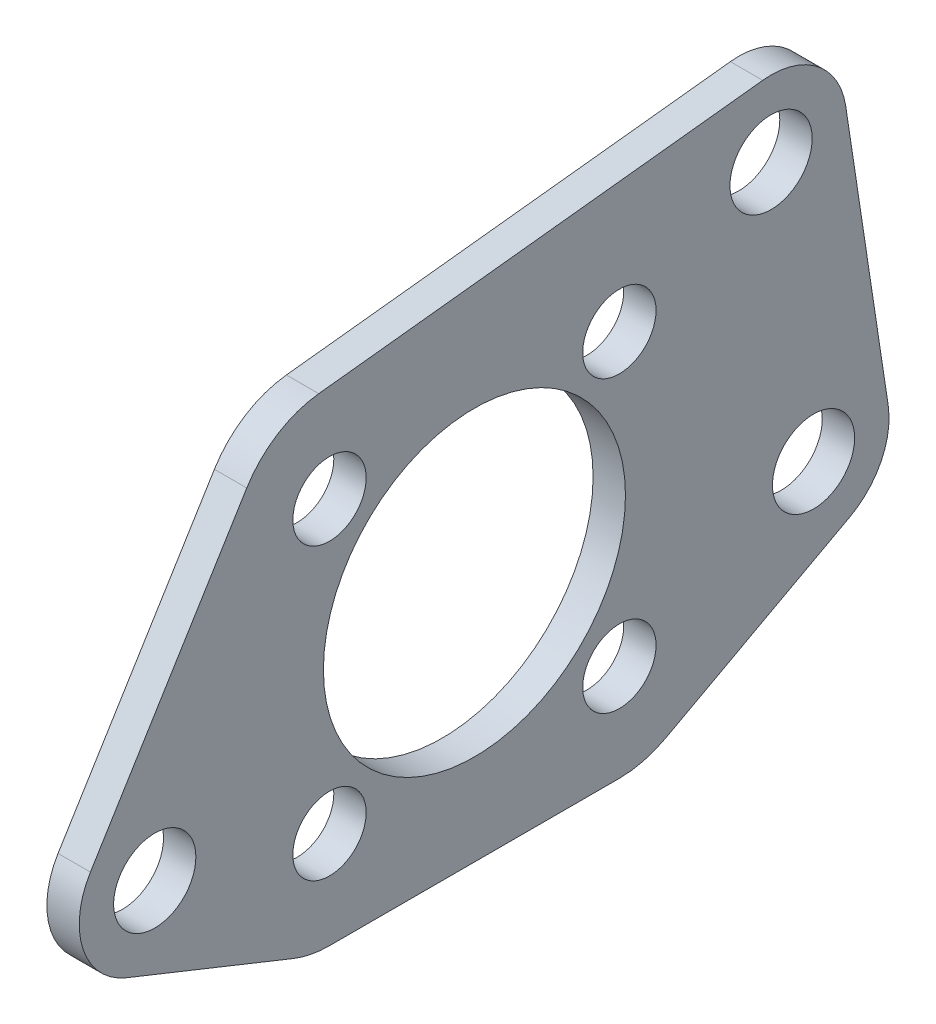
ISO-10303-21;
HEADER;
FILE_DESCRIPTION(('STEP AP214'),'2;1');
FILE_NAME('part.step','',(''),(''),'','','');
FILE_SCHEMA(('AUTOMOTIVE_DESIGN { 1 0 10303 214 1 1 1 1 }'));
ENDSEC;
DATA;
#1=APPLICATION_CONTEXT('core data for automotive mechanical design processes');
#2=APPLICATION_PROTOCOL_DEFINITION('international standard','automotive_design',2000,#1);
#3=PRODUCT_CONTEXT('',#1,'mechanical');
#4=PRODUCT('Part','Part','',(#3));
#5=PRODUCT_RELATED_PRODUCT_CATEGORY('part','',(#4));
#6=PRODUCT_DEFINITION_FORMATION('','',#4);
#7=PRODUCT_DEFINITION_CONTEXT('part definition',#1,'design');
#8=PRODUCT_DEFINITION('design','',#6,#7);
#9=PRODUCT_DEFINITION_SHAPE('','',#8);
#10=(LENGTH_UNIT() NAMED_UNIT(*) SI_UNIT(.MILLI.,.METRE.));
#11=(NAMED_UNIT(*) PLANE_ANGLE_UNIT() SI_UNIT($,.RADIAN.));
#12=(NAMED_UNIT(*) SI_UNIT($,.STERADIAN.) SOLID_ANGLE_UNIT());
#13=UNCERTAINTY_MEASURE_WITH_UNIT(LENGTH_MEASURE(1.E-05),#10,'distance_accuracy_value','');
#14=(GEOMETRIC_REPRESENTATION_CONTEXT(3) GLOBAL_UNCERTAINTY_ASSIGNED_CONTEXT((#13)) GLOBAL_UNIT_ASSIGNED_CONTEXT((#10,
#11,#12)) REPRESENTATION_CONTEXT('',''));
#15=CARTESIAN_POINT('',(0.,0.,0.));
#16=DIRECTION('',(0.,0.,1.));
#17=DIRECTION('',(1.,0.,0.));
#18=AXIS2_PLACEMENT_3D('',#15,#16,#17);
#19=CARTESIAN_POINT('',(105.440106080913,27.7175144212722,115.08697369881));
#20=DIRECTION('',(-1.,0.,0.));
#21=DIRECTION('',(0.,0.,1.));
#22=AXIS2_PLACEMENT_3D('',#19,#20,#21);
#23=CYLINDRICAL_SURFACE('',#22,1.7);
#24=CARTESIAN_POINT('',(59.,27.7175144212722,115.08697369881));
#25=DIRECTION('',(1.,0.,0.));
#26=DIRECTION('',(0.,0.,-1.));
#27=AXIS2_PLACEMENT_3D('',#24,#25,#26);
#28=CIRCLE('',#27,1.7);
#29=CARTESIAN_POINT('',(59.,27.7175144212722,113.38697369881));
#30=VERTEX_POINT('',#29);
#31=EDGE_CURVE('E182',#30,#30,#28,.T.);
#32=ORIENTED_EDGE('',*,*,#31,.F.);
#33=EDGE_LOOP('',(#32));
#34=FACE_BOUND('',#33,.T.);
#35=CARTESIAN_POINT('',(60.5,27.7175144212722,115.08697369881));
#36=DIRECTION('',(1.,0.,0.));
#37=DIRECTION('',(0.,0.,-1.));
#38=AXIS2_PLACEMENT_3D('',#35,#36,#37);
#39=CIRCLE('',#38,1.7);
#40=CARTESIAN_POINT('',(60.5,27.7175144212722,113.38697369881));
#41=VERTEX_POINT('',#40);
#42=EDGE_CURVE('E489',#41,#41,#39,.T.);
#43=ORIENTED_EDGE('',*,*,#42,.T.);
#44=EDGE_LOOP('',(#43));
#45=FACE_BOUND('',#44,.T.);
#46=ADVANCED_FACE('F39',(#34,#45),#23,.F.);
#47=CARTESIAN_POINT('',(105.440106080913,14.2824855787278,115.086973698809));
#48=DIRECTION('',(-1.,0.,0.));
#49=DIRECTION('',(0.,0.,1.));
#50=AXIS2_PLACEMENT_3D('',#47,#48,#49);
#51=CYLINDRICAL_SURFACE('',#50,1.7);
#52=CARTESIAN_POINT('',(59.,14.2824855787278,115.086973698809));
#53=DIRECTION('',(1.,0.,0.));
#54=DIRECTION('',(0.,0.,-1.));
#55=AXIS2_PLACEMENT_3D('',#52,#53,#54);
#56=CIRCLE('',#55,1.7);
#57=CARTESIAN_POINT('',(59.,14.2824855787278,113.386973698809));
#58=VERTEX_POINT('',#57);
#59=EDGE_CURVE('E185',#58,#58,#56,.T.);
#60=ORIENTED_EDGE('',*,*,#59,.F.);
#61=EDGE_LOOP('',(#60));
#62=FACE_BOUND('',#61,.T.);
#63=CARTESIAN_POINT('',(60.5,14.2824855787278,115.086973698809));
#64=DIRECTION('',(1.,0.,0.));
#65=DIRECTION('',(0.,0.,-1.));
#66=AXIS2_PLACEMENT_3D('',#63,#64,#65);
#67=CIRCLE('',#66,1.7);
#68=CARTESIAN_POINT('',(60.5,14.2824855787278,113.386973698809));
#69=VERTEX_POINT('',#68);
#70=EDGE_CURVE('E493',#69,#69,#67,.T.);
#71=ORIENTED_EDGE('',*,*,#70,.T.);
#72=EDGE_LOOP('',(#71));
#73=FACE_BOUND('',#72,.T.);
#74=ADVANCED_FACE('F302',(#62,#73),#51,.F.);
#75=CARTESIAN_POINT('',(105.440106080913,14.2824855787278,101.651944856265));
#76=DIRECTION('',(-1.,0.,0.));
#77=DIRECTION('',(0.,0.,1.));
#78=AXIS2_PLACEMENT_3D('',#75,#76,#77);
#79=CYLINDRICAL_SURFACE('',#78,1.7);
#80=CARTESIAN_POINT('',(59.,14.2824855787278,101.651944856265));
#81=DIRECTION('',(1.,0.,0.));
#82=DIRECTION('',(0.,0.,-1.));
#83=AXIS2_PLACEMENT_3D('',#80,#81,#82);
#84=CIRCLE('',#83,1.7);
#85=CARTESIAN_POINT('',(59.,14.2824855787278,99.9519448562651));
#86=VERTEX_POINT('',#85);
#87=EDGE_CURVE('E188',#86,#86,#84,.T.);
#88=ORIENTED_EDGE('',*,*,#87,.F.);
#89=EDGE_LOOP('',(#88));
#90=FACE_BOUND('',#89,.T.);
#91=CARTESIAN_POINT('',(60.5,14.2824855787278,101.651944856265));
#92=DIRECTION('',(1.,0.,0.));
#93=DIRECTION('',(0.,0.,-1.));
#94=AXIS2_PLACEMENT_3D('',#91,#92,#93);
#95=CIRCLE('',#94,1.7);
#96=CARTESIAN_POINT('',(60.5,14.2824855787278,99.9519448562651));
#97=VERTEX_POINT('',#96);
#98=EDGE_CURVE('E497',#97,#97,#95,.T.);
#99=ORIENTED_EDGE('',*,*,#98,.T.);
#100=EDGE_LOOP('',(#99));
#101=FACE_BOUND('',#100,.T.);
#102=ADVANCED_FACE('F309',(#90,#101),#79,.F.);
#103=CARTESIAN_POINT('',(105.440106080913,16.4458298924749,123.185313442307));
#104=DIRECTION('',(-1.,0.,0.));
#105=DIRECTION('',(0.,0.,1.));
#106=AXIS2_PLACEMENT_3D('',#103,#104,#105);
#107=CYLINDRICAL_SURFACE('',#106,1.90500000000001);
#108=CARTESIAN_POINT('',(59.,16.4458298924749,123.185313442307));
#109=DIRECTION('',(1.,0.,0.));
#110=DIRECTION('',(0.,0.,-1.));
#111=AXIS2_PLACEMENT_3D('',#108,#109,#110);
#112=CIRCLE('',#111,1.90500000000001);
#113=CARTESIAN_POINT('',(59.,16.4458298924749,121.280313442307));
#114=VERTEX_POINT('',#113);
#115=EDGE_CURVE('E191',#114,#114,#112,.T.);
#116=ORIENTED_EDGE('',*,*,#115,.F.);
#117=EDGE_LOOP('',(#116));
#118=FACE_BOUND('',#117,.T.);
#119=CARTESIAN_POINT('',(60.5,16.4458298924749,123.185313442307));
#120=DIRECTION('',(1.,0.,0.));
#121=DIRECTION('',(0.,0.,-1.));
#122=AXIS2_PLACEMENT_3D('',#119,#120,#121);
#123=CIRCLE('',#122,1.90500000000001);
#124=CARTESIAN_POINT('',(60.5,16.4458298924749,121.280313442307));
#125=VERTEX_POINT('',#124);
#126=EDGE_CURVE('E501',#125,#125,#123,.T.);
#127=ORIENTED_EDGE('',*,*,#126,.T.);
#128=EDGE_LOOP('',(#127));
#129=FACE_BOUND('',#128,.T.);
#130=ADVANCED_FACE('F320',(#118,#129),#107,.F.);
#131=CARTESIAN_POINT('',(105.440106080913,18.,92.6532256320356));
#132=DIRECTION('',(-1.,0.,0.));
#133=DIRECTION('',(0.,0.,1.));
#134=AXIS2_PLACEMENT_3D('',#131,#132,#133);
#135=CYLINDRICAL_SURFACE('',#134,1.90500000000001);
#136=CARTESIAN_POINT('',(59.,18.,92.6532256320356));
#137=DIRECTION('',(1.,0.,0.));
#138=DIRECTION('',(0.,0.,-1.));
#139=AXIS2_PLACEMENT_3D('',#136,#137,#138);
#140=CIRCLE('',#139,1.90500000000001);
#141=CARTESIAN_POINT('',(59.,18.,90.7482256320356));
#142=VERTEX_POINT('',#141);
#143=EDGE_CURVE('E194',#142,#142,#140,.T.);
#144=ORIENTED_EDGE('',*,*,#143,.F.);
#145=EDGE_LOOP('',(#144));
#146=FACE_BOUND('',#145,.T.);
#147=CARTESIAN_POINT('',(60.5,18.,92.6532256320356));
#148=DIRECTION('',(1.,0.,0.));
#149=DIRECTION('',(0.,0.,-1.));
#150=AXIS2_PLACEMENT_3D('',#147,#148,#149);
#151=CIRCLE('',#150,1.90500000000001);
#152=CARTESIAN_POINT('',(60.5,18.,90.7482256320356));
#153=VERTEX_POINT('',#152);
#154=EDGE_CURVE('E505',#153,#153,#151,.T.);
#155=ORIENTED_EDGE('',*,*,#154,.T.);
#156=EDGE_LOOP('',(#155));
#157=FACE_BOUND('',#156,.T.);
#158=ADVANCED_FACE('F324',(#146,#157),#135,.F.);
#159=CARTESIAN_POINT('',(105.440106080913,31.,94.6217321926698));
#160=DIRECTION('',(-1.,0.,0.));
#161=DIRECTION('',(0.,0.,1.));
#162=AXIS2_PLACEMENT_3D('',#159,#160,#161);
#163=CYLINDRICAL_SURFACE('',#162,1.90500000000001);
#164=CARTESIAN_POINT('',(59.,31.,94.6217321926698));
#165=DIRECTION('',(1.,0.,0.));
#166=DIRECTION('',(0.,0.,-1.));
#167=AXIS2_PLACEMENT_3D('',#164,#165,#166);
#168=CIRCLE('',#167,1.90500000000001);
#169=CARTESIAN_POINT('',(59.,31.,92.7167321926698));
#170=VERTEX_POINT('',#169);
#171=EDGE_CURVE('E197',#170,#170,#168,.T.);
#172=ORIENTED_EDGE('',*,*,#171,.F.);
#173=EDGE_LOOP('',(#172));
#174=FACE_BOUND('',#173,.T.);
#175=CARTESIAN_POINT('',(60.5,31.,94.6217321926698));
#176=DIRECTION('',(1.,0.,0.));
#177=DIRECTION('',(0.,0.,-1.));
#178=AXIS2_PLACEMENT_3D('',#175,#176,#177);
#179=CIRCLE('',#178,1.90500000000001);
#180=CARTESIAN_POINT('',(60.5,31.,92.7167321926698));
#181=VERTEX_POINT('',#180);
#182=EDGE_CURVE('E153',#181,#181,#179,.T.);
#183=ORIENTED_EDGE('',*,*,#182,.T.);
#184=EDGE_LOOP('',(#183));
#185=FACE_BOUND('',#184,.T.);
#186=ADVANCED_FACE('F328',(#174,#185),#163,.F.);
#187=CARTESIAN_POINT('',(105.440106080913,27.7175144212722,101.651944856265));
#188=DIRECTION('',(-1.,0.,0.));
#189=DIRECTION('',(0.,0.,1.));
#190=AXIS2_PLACEMENT_3D('',#187,#188,#189);
#191=CYLINDRICAL_SURFACE('',#190,1.7);
#192=CARTESIAN_POINT('',(59.,27.7175144212722,101.651944856265));
#193=DIRECTION('',(1.,0.,0.));
#194=DIRECTION('',(0.,0.,-1.));
#195=AXIS2_PLACEMENT_3D('',#192,#193,#194);
#196=CIRCLE('',#195,1.7);
#197=CARTESIAN_POINT('',(59.,27.7175144212722,99.9519448562651));
#198=VERTEX_POINT('',#197);
#199=EDGE_CURVE('E200',#198,#198,#196,.T.);
#200=ORIENTED_EDGE('',*,*,#199,.F.);
#201=EDGE_LOOP('',(#200));
#202=FACE_BOUND('',#201,.T.);
#203=CARTESIAN_POINT('',(60.5,27.7175144212722,101.651944856265));
#204=DIRECTION('',(1.,0.,0.));
#205=DIRECTION('',(0.,0.,-1.));
#206=AXIS2_PLACEMENT_3D('',#203,#204,#205);
#207=CIRCLE('',#206,1.7);
#208=CARTESIAN_POINT('',(60.5,27.7175144212722,99.9519448562651));
#209=VERTEX_POINT('',#208);
#210=EDGE_CURVE('E148',#209,#209,#207,.T.);
#211=ORIENTED_EDGE('',*,*,#210,.T.);
#212=EDGE_LOOP('',(#211));
#213=FACE_BOUND('',#212,.T.);
#214=ADVANCED_FACE('F299',(#202,#213),#191,.F.);
#215=CARTESIAN_POINT('',(105.440106080913,34.4785482188987,95.0086459928841));
#216=DIRECTION('',(0.,-0.993870919685359,-0.110546800061233));
#217=DIRECTION('',(0.,0.110546800061233,-0.993870919685359));
#218=AXIS2_PLACEMENT_3D('',#215,#216,#217);
#219=PLANE('',#218);
#220=DIRECTION('',(0.,-0.110546800061233,0.993870919685359));
#221=VECTOR('',#220,1.);
#222=CARTESIAN_POINT('',(60.5,34.4785482188987,95.0086459928841));
#223=LINE('',#222,#221);
#224=CARTESIAN_POINT('',(60.5,34.4785482188987,95.0086459928841));
#225=VERTEX_POINT('',#224);
#226=CARTESIAN_POINT('',(60.5,32.1899335598563,115.584434299085));
#227=VERTEX_POINT('',#226);
#228=EDGE_CURVE('E132',#225,#227,#223,.T.);
#229=ORIENTED_EDGE('',*,*,#228,.F.);
#230=DIRECTION('',(-1.,0.,0.));
#231=VECTOR('',#230,1.);
#232=CARTESIAN_POINT('',(105.440106080913,34.4785482188987,95.0086459928841));
#233=LINE('',#232,#231);
#234=CARTESIAN_POINT('',(59.,34.4785482188987,95.0086459928841));
#235=VERTEX_POINT('',#234);
#236=EDGE_CURVE('E55',#225,#235,#233,.T.);
#237=ORIENTED_EDGE('',*,*,#236,.T.);
#238=DIRECTION('',(0.,-0.110546800061233,0.993870919685359));
#239=VECTOR('',#238,1.);
#240=CARTESIAN_POINT('',(59.,34.4785482188987,95.0086459928841));
#241=LINE('',#240,#239);
#242=CARTESIAN_POINT('',(59.,32.1899335598563,115.584434299085));
#243=VERTEX_POINT('',#242);
#244=EDGE_CURVE('E135',#235,#243,#241,.T.);
#245=ORIENTED_EDGE('',*,*,#244,.T.);
#246=DIRECTION('',(-1.,0.,0.));
#247=VECTOR('',#246,1.);
#248=CARTESIAN_POINT('',(105.440106080913,32.1899335598563,115.584434299085));
#249=LINE('',#248,#247);
#250=EDGE_CURVE('E128',#227,#243,#249,.T.);
#251=ORIENTED_EDGE('',*,*,#250,.F.);
#252=EDGE_LOOP('',(#229,#237,#245,#251));
#253=FACE_BOUND('',#252,.T.);
#254=ADVANCED_FACE('F130',(#253),#219,.F.);
#255=CARTESIAN_POINT('',(105.440106080913,31.,94.6217321926698));
#256=DIRECTION('',(-1.,0.,0.));
#257=DIRECTION('',(0.,0.,1.));
#258=AXIS2_PLACEMENT_3D('',#255,#256,#257);
#259=CYLINDRICAL_SURFACE('',#258,3.49999999999998);
#260=CARTESIAN_POINT('',(60.5,31.,94.6217321926698));
#261=DIRECTION('',(1.,0.,0.));
#262=DIRECTION('',(0.,0.,-1.));
#263=AXIS2_PLACEMENT_3D('',#260,#261,#262);
#264=CIRCLE('',#263,3.49999999999998);
#265=CARTESIAN_POINT('',(60.5,31.5240090548396,91.1611810067391));
#266=VERTEX_POINT('',#265);
#267=EDGE_CURVE('E147',#266,#225,#264,.T.);
#268=ORIENTED_EDGE('',*,*,#267,.F.);
#269=DIRECTION('',(-1.,0.,0.));
#270=VECTOR('',#269,1.);
#271=CARTESIAN_POINT('',(105.440106080913,31.5240090548396,91.1611810067391));
#272=LINE('',#271,#270);
#273=CARTESIAN_POINT('',(59.,31.5240090548396,91.1611810067391));
#274=VERTEX_POINT('',#273);
#275=EDGE_CURVE('E236',#266,#274,#272,.T.);
#276=ORIENTED_EDGE('',*,*,#275,.T.);
#277=CARTESIAN_POINT('',(59.,31.,94.6217321926698));
#278=DIRECTION('',(1.,0.,0.));
#279=DIRECTION('',(0.,0.,-1.));
#280=AXIS2_PLACEMENT_3D('',#277,#278,#279);
#281=CIRCLE('',#280,3.49999999999998);
#282=EDGE_CURVE('E232',#274,#235,#281,.T.);
#283=ORIENTED_EDGE('',*,*,#282,.T.);
#284=ORIENTED_EDGE('',*,*,#236,.F.);
#285=EDGE_LOOP('',(#268,#276,#283,#284));
#286=FACE_BOUND('',#285,.T.);
#287=ADVANCED_FACE('F290',(#286),#259,.T.);
#288=CARTESIAN_POINT('',(105.440106080913,18.5240090548396,89.192674446105));
#289=DIRECTION('',(0.,-0.149716872811316,0.988728910265903));
#290=DIRECTION('',(0.,-0.988728910265903,-0.149716872811316));
#291=AXIS2_PLACEMENT_3D('',#288,#289,#290);
#292=PLANE('',#291);
#293=DIRECTION('',(0.,0.988728910265903,0.149716872811316));
#294=VECTOR('',#293,1.);
#295=CARTESIAN_POINT('',(60.5,18.5240090548396,89.192674446105));
#296=LINE('',#295,#294);
#297=CARTESIAN_POINT('',(60.5,18.5240090548396,89.192674446105));
#298=VERTEX_POINT('',#297);
#299=EDGE_CURVE('E150',#298,#266,#296,.T.);
#300=ORIENTED_EDGE('',*,*,#299,.F.);
#301=DIRECTION('',(-1.,0.,0.));
#302=VECTOR('',#301,1.);
#303=CARTESIAN_POINT('',(105.440106080913,18.5240090548396,89.192674446105));
#304=LINE('',#303,#302);
#305=CARTESIAN_POINT('',(59.,18.5240090548396,89.192674446105));
#306=VERTEX_POINT('',#305);
#307=EDGE_CURVE('E238',#298,#306,#304,.T.);
#308=ORIENTED_EDGE('',*,*,#307,.T.);
#309=DIRECTION('',(0.,0.988728910265903,0.149716872811316));
#310=VECTOR('',#309,1.);
#311=CARTESIAN_POINT('',(59.,18.5240090548396,89.192674446105));
#312=LINE('',#311,#310);
#313=EDGE_CURVE('E229',#306,#274,#312,.T.);
#314=ORIENTED_EDGE('',*,*,#313,.T.);
#315=ORIENTED_EDGE('',*,*,#275,.F.);
#316=EDGE_LOOP('',(#300,#308,#314,#315));
#317=FACE_BOUND('',#316,.T.);
#318=ADVANCED_FACE('F287',(#317),#292,.F.);
#319=CARTESIAN_POINT('',(105.440106080913,18.,92.6532256320356));
#320=DIRECTION('',(-1.,0.,0.));
#321=DIRECTION('',(0.,0.,1.));
#322=AXIS2_PLACEMENT_3D('',#319,#320,#321);
#323=CYLINDRICAL_SURFACE('',#322,3.49999999999998);
#324=CARTESIAN_POINT('',(60.5,18.,92.6532256320356));
#325=DIRECTION('',(1.,0.,0.));
#326=DIRECTION('',(0.,0.,-1.));
#327=AXIS2_PLACEMENT_3D('',#324,#325,#326);
#328=CIRCLE('',#327,3.49999999999998);
#329=CARTESIAN_POINT('',(60.5,14.9195294310786,90.9916898743678));
#330=VERTEX_POINT('',#329);
#331=EDGE_CURVE('E158',#330,#298,#328,.T.);
#332=ORIENTED_EDGE('',*,*,#331,.F.);
#333=DIRECTION('',(-1.,0.,0.));
#334=VECTOR('',#333,1.);
#335=CARTESIAN_POINT('',(105.440106080913,14.9195294310786,90.9916898743678));
#336=LINE('',#335,#334);
#337=CARTESIAN_POINT('',(59.,14.9195294310786,90.9916898743678));
#338=VERTEX_POINT('',#337);
#339=EDGE_CURVE('E240',#330,#338,#336,.T.);
#340=ORIENTED_EDGE('',*,*,#339,.T.);
#341=CARTESIAN_POINT('',(59.,18.,92.6532256320356));
#342=DIRECTION('',(1.,0.,0.));
#343=DIRECTION('',(0.,0.,-1.));
#344=AXIS2_PLACEMENT_3D('',#341,#342,#343);
#345=CIRCLE('',#344,3.49999999999998);
#346=EDGE_CURVE('E226',#338,#306,#345,.T.);
#347=ORIENTED_EDGE('',*,*,#346,.T.);
#348=ORIENTED_EDGE('',*,*,#307,.F.);
#349=EDGE_LOOP('',(#332,#340,#347,#348));
#350=FACE_BOUND('',#349,.T.);
#351=ADVANCED_FACE('F283',(#350),#323,.T.);
#352=CARTESIAN_POINT('',(105.440106080913,10.3218805615431,99.5156845964065));
#353=DIRECTION('',(0.,0.880134448263272,0.474724502190804));
#354=DIRECTION('',(0.,-0.474724502190804,0.880134448263272));
#355=AXIS2_PLACEMENT_3D('',#352,#353,#354);
#356=PLANE('',#355);
#357=DIRECTION('',(0.,0.474724502190804,-0.880134448263272));
#358=VECTOR('',#357,1.);
#359=CARTESIAN_POINT('',(60.5,10.3218805615431,99.5156845964065));
#360=LINE('',#359,#358);
#361=CARTESIAN_POINT('',(60.5,10.3218805615431,99.5156845964065));
#362=VERTEX_POINT('',#361);
#363=EDGE_CURVE('E161',#362,#330,#360,.T.);
#364=ORIENTED_EDGE('',*,*,#363,.F.);
#365=DIRECTION('',(-1.,0.,0.));
#366=VECTOR('',#365,1.);
#367=CARTESIAN_POINT('',(105.440106080913,10.3218805615431,99.5156845964065));
#368=LINE('',#367,#366);
#369=CARTESIAN_POINT('',(59.,10.3218805615431,99.5156845964065));
#370=VERTEX_POINT('',#369);
#371=EDGE_CURVE('E242',#362,#370,#368,.T.);
#372=ORIENTED_EDGE('',*,*,#371,.T.);
#373=DIRECTION('',(0.,0.474724502190804,-0.880134448263272));
#374=VECTOR('',#373,1.);
#375=CARTESIAN_POINT('',(59.,10.3218805615431,99.5156845964065));
#376=LINE('',#375,#374);
#377=EDGE_CURVE('E223',#370,#338,#376,.T.);
#378=ORIENTED_EDGE('',*,*,#377,.T.);
#379=ORIENTED_EDGE('',*,*,#339,.F.);
#380=EDGE_LOOP('',(#364,#372,#378,#379));
#381=FACE_BOUND('',#380,.T.);
#382=ADVANCED_FACE('F280',(#381),#356,.F.);
#383=CARTESIAN_POINT('',(105.440106080913,14.2824855787278,101.651944856265));
#384=DIRECTION('',(-1.,0.,0.));
#385=DIRECTION('',(0.,0.,1.));
#386=AXIS2_PLACEMENT_3D('',#383,#384,#385);
#387=CYLINDRICAL_SURFACE('',#386,4.49999999999999);
#388=CARTESIAN_POINT('',(60.5,14.2824855787278,101.651944856265));
#389=DIRECTION('',(1.,0.,0.));
#390=DIRECTION('',(0.,0.,-1.));
#391=AXIS2_PLACEMENT_3D('',#388,#389,#390);
#392=CIRCLE('',#391,4.49999999999999);
#393=CARTESIAN_POINT('',(60.5,9.78248557872781,101.651944856265));
#394=VERTEX_POINT('',#393);
#395=EDGE_CURVE('E164',#394,#362,#392,.T.);
#396=ORIENTED_EDGE('',*,*,#395,.F.);
#397=DIRECTION('',(-1.,0.,0.));
#398=VECTOR('',#397,1.);
#399=CARTESIAN_POINT('',(105.440106080913,9.78248557872781,101.651944856265));
#400=LINE('',#399,#398);
#401=CARTESIAN_POINT('',(59.,9.78248557872781,101.651944856265));
#402=VERTEX_POINT('',#401);
#403=EDGE_CURVE('E244',#394,#402,#400,.T.);
#404=ORIENTED_EDGE('',*,*,#403,.T.);
#405=CARTESIAN_POINT('',(59.,14.2824855787278,101.651944856265));
#406=DIRECTION('',(1.,0.,0.));
#407=DIRECTION('',(0.,0.,-1.));
#408=AXIS2_PLACEMENT_3D('',#405,#406,#407);
#409=CIRCLE('',#408,4.49999999999999);
#410=EDGE_CURVE('E220',#402,#370,#409,.T.);
#411=ORIENTED_EDGE('',*,*,#410,.T.);
#412=ORIENTED_EDGE('',*,*,#371,.F.);
#413=EDGE_LOOP('',(#396,#404,#411,#412));
#414=FACE_BOUND('',#413,.T.);
#415=ADVANCED_FACE('F275',(#414),#387,.T.);
#416=CARTESIAN_POINT('',(105.440106080913,9.78248557872779,115.08697369881));
#417=DIRECTION('',(0.,1.,0.));
#418=DIRECTION('',(0.,0.,1.));
#419=AXIS2_PLACEMENT_3D('',#416,#417,#418);
#420=PLANE('',#419);
#421=DIRECTION('',(0.,0.,-1.));
#422=VECTOR('',#421,1.);
#423=CARTESIAN_POINT('',(60.5,9.78248557872779,115.08697369881));
#424=LINE('',#423,#422);
#425=CARTESIAN_POINT('',(60.5,9.78248557872779,115.08697369881));
#426=VERTEX_POINT('',#425);
#427=EDGE_CURVE('E167',#426,#394,#424,.T.);
#428=ORIENTED_EDGE('',*,*,#427,.F.);
#429=DIRECTION('',(-1.,0.,0.));
#430=VECTOR('',#429,1.);
#431=CARTESIAN_POINT('',(105.440106080913,9.78248557872779,115.08697369881));
#432=LINE('',#431,#430);
#433=CARTESIAN_POINT('',(59.,9.78248557872779,115.08697369881));
#434=VERTEX_POINT('',#433);
#435=EDGE_CURVE('E246',#426,#434,#432,.T.);
#436=ORIENTED_EDGE('',*,*,#435,.T.);
#437=DIRECTION('',(0.,0.,-1.));
#438=VECTOR('',#437,1.);
#439=CARTESIAN_POINT('',(59.,9.78248557872779,115.08697369881));
#440=LINE('',#439,#438);
#441=EDGE_CURVE('E217',#434,#402,#440,.T.);
#442=ORIENTED_EDGE('',*,*,#441,.T.);
#443=ORIENTED_EDGE('',*,*,#403,.F.);
#444=EDGE_LOOP('',(#428,#436,#442,#443));
#445=FACE_BOUND('',#444,.T.);
#446=ADVANCED_FACE('F271',(#445),#420,.F.);
#447=CARTESIAN_POINT('',(105.440106080913,14.2824855787278,115.086973698809));
#448=DIRECTION('',(-1.,0.,0.));
#449=DIRECTION('',(0.,0.,1.));
#450=AXIS2_PLACEMENT_3D('',#447,#448,#449);
#451=CYLINDRICAL_SURFACE('',#450,4.5);
#452=CARTESIAN_POINT('',(60.5,14.2824855787278,115.086973698809));
#453=DIRECTION('',(1.,0.,0.));
#454=DIRECTION('',(0.,0.,-1.));
#455=AXIS2_PLACEMENT_3D('',#452,#453,#454);
#456=CIRCLE('',#455,4.5);
#457=CARTESIAN_POINT('',(60.5,10.1045346619018,116.758717141026));
#458=VERTEX_POINT('',#457);
#459=EDGE_CURVE('E170',#458,#426,#456,.T.);
#460=ORIENTED_EDGE('',*,*,#459,.F.);
#461=DIRECTION('',(-1.,0.,0.));
#462=VECTOR('',#461,1.);
#463=CARTESIAN_POINT('',(105.440106080913,10.1045346619018,116.758717141026));
#464=LINE('',#463,#462);
#465=CARTESIAN_POINT('',(59.,10.1045346619018,116.758717141026));
#466=VERTEX_POINT('',#465);
#467=EDGE_CURVE('E248',#458,#466,#464,.T.);
#468=ORIENTED_EDGE('',*,*,#467,.T.);
#469=CARTESIAN_POINT('',(59.,14.2824855787278,115.086973698809));
#470=DIRECTION('',(1.,0.,0.));
#471=DIRECTION('',(0.,0.,-1.));
#472=AXIS2_PLACEMENT_3D('',#469,#470,#471);
#473=CIRCLE('',#472,4.5);
#474=EDGE_CURVE('E214',#466,#434,#473,.T.);
#475=ORIENTED_EDGE('',*,*,#474,.T.);
#476=ORIENTED_EDGE('',*,*,#435,.F.);
#477=EDGE_LOOP('',(#460,#468,#475,#476));
#478=FACE_BOUND('',#477,.T.);
#479=ADVANCED_FACE('F269',(#478),#451,.T.);
#480=CARTESIAN_POINT('',(105.440106080913,13.1963125127214,124.485558341808));
#481=DIRECTION('',(0.,0.92843353707245,-0.371498542714692));
#482=DIRECTION('',(0.,0.371498542714692,0.92843353707245));
#483=AXIS2_PLACEMENT_3D('',#480,#481,#482);
#484=PLANE('',#483);
#485=DIRECTION('',(0.,-0.371498542714692,-0.92843353707245));
#486=VECTOR('',#485,1.);
#487=CARTESIAN_POINT('',(60.5,13.1963125127214,124.485558341808));
#488=LINE('',#487,#486);
#489=CARTESIAN_POINT('',(60.5,13.1963125127214,124.485558341808));
#490=VERTEX_POINT('',#489);
#491=EDGE_CURVE('E173',#490,#458,#488,.T.);
#492=ORIENTED_EDGE('',*,*,#491,.F.);
#493=DIRECTION('',(-1.,0.,0.));
#494=VECTOR('',#493,1.);
#495=CARTESIAN_POINT('',(105.440106080913,13.1963125127214,124.485558341808));
#496=LINE('',#495,#494);
#497=CARTESIAN_POINT('',(59.,13.1963125127214,124.485558341808));
#498=VERTEX_POINT('',#497);
#499=EDGE_CURVE('E250',#490,#498,#496,.T.);
#500=ORIENTED_EDGE('',*,*,#499,.T.);
#501=DIRECTION('',(0.,-0.371498542714692,-0.92843353707245));
#502=VECTOR('',#501,1.);
#503=CARTESIAN_POINT('',(59.,13.1963125127214,124.485558341808));
#504=LINE('',#503,#502);
#505=EDGE_CURVE('E211',#498,#466,#504,.T.);
#506=ORIENTED_EDGE('',*,*,#505,.T.);
#507=ORIENTED_EDGE('',*,*,#467,.F.);
#508=EDGE_LOOP('',(#492,#500,#506,#507));
#509=FACE_BOUND('',#508,.T.);
#510=ADVANCED_FACE('F266',(#509),#484,.F.);
#511=CARTESIAN_POINT('',(105.440106080913,16.4458298924749,123.185313442307));
#512=DIRECTION('',(-1.,0.,0.));
#513=DIRECTION('',(0.,0.,1.));
#514=AXIS2_PLACEMENT_3D('',#511,#512,#513);
#515=CYLINDRICAL_SURFACE('',#514,3.50000000000002);
#516=CARTESIAN_POINT('',(60.5,16.4458298924749,123.185313442307));
#517=DIRECTION('',(1.,0.,0.));
#518=DIRECTION('',(0.,0.,-1.));
#519=AXIS2_PLACEMENT_3D('',#516,#517,#518);
#520=CIRCLE('',#519,3.50000000000002);
#521=CARTESIAN_POINT('',(60.5,18.2779218869701,126.167500378719));
#522=VERTEX_POINT('',#521);
#523=EDGE_CURVE('E176',#522,#490,#520,.T.);
#524=ORIENTED_EDGE('',*,*,#523,.F.);
#525=DIRECTION('',(-1.,0.,0.));
#526=VECTOR('',#525,1.);
#527=CARTESIAN_POINT('',(105.440106080913,18.2779218869701,126.167500378719));
#528=LINE('',#527,#526);
#529=CARTESIAN_POINT('',(59.,18.2779218869701,126.167500378719));
#530=VERTEX_POINT('',#529);
#531=EDGE_CURVE('E48',#522,#530,#528,.T.);
#532=ORIENTED_EDGE('',*,*,#531,.T.);
#533=CARTESIAN_POINT('',(59.,16.4458298924749,123.185313442307));
#534=DIRECTION('',(1.,0.,0.));
#535=DIRECTION('',(0.,0.,-1.));
#536=AXIS2_PLACEMENT_3D('',#533,#534,#535);
#537=CIRCLE('',#536,3.50000000000002);
#538=EDGE_CURVE('E208',#530,#498,#537,.T.);
#539=ORIENTED_EDGE('',*,*,#538,.T.);
#540=ORIENTED_EDGE('',*,*,#499,.F.);
#541=EDGE_LOOP('',(#524,#532,#539,#540));
#542=FACE_BOUND('',#541,.T.);
#543=ADVANCED_FACE('F253',(#542),#515,.T.);
#544=CARTESIAN_POINT('',(105.440106080913,30.0730612713375,118.921214045625));
#545=DIRECTION('',(0.,-0.523454855570055,-0.85205341040344));
#546=DIRECTION('',(0.,0.85205341040344,-0.523454855570055));
#547=AXIS2_PLACEMENT_3D('',#544,#545,#546);
#548=PLANE('',#547);
#549=DIRECTION('',(0.,-0.85205341040344,0.523454855570055));
#550=VECTOR('',#549,1.);
#551=CARTESIAN_POINT('',(60.5,30.0730612713375,118.921214045625));
#552=LINE('',#551,#550);
#553=CARTESIAN_POINT('',(60.5,30.0730612713375,118.921214045625));
#554=VERTEX_POINT('',#553);
#555=EDGE_CURVE('E62',#554,#522,#552,.T.);
#556=ORIENTED_EDGE('',*,*,#555,.F.);
#557=DIRECTION('',(-1.,0.,0.));
#558=VECTOR('',#557,1.);
#559=CARTESIAN_POINT('',(105.440106080913,30.0730612713375,118.921214045625));
#560=LINE('',#559,#558);
#561=CARTESIAN_POINT('',(59.,30.0730612713375,118.921214045625));
#562=VERTEX_POINT('',#561);
#563=EDGE_CURVE('E11',#554,#562,#560,.T.);
#564=ORIENTED_EDGE('',*,*,#563,.T.);
#565=DIRECTION('',(0.,-0.85205341040344,0.523454855570055));
#566=VECTOR('',#565,1.);
#567=CARTESIAN_POINT('',(59.,30.0730612713375,118.921214045625));
#568=LINE('',#567,#566);
#569=EDGE_CURVE('E205',#562,#530,#568,.T.);
#570=ORIENTED_EDGE('',*,*,#569,.T.);
#571=ORIENTED_EDGE('',*,*,#531,.F.);
#572=EDGE_LOOP('',(#556,#564,#570,#571));
#573=FACE_BOUND('',#572,.T.);
#574=ADVANCED_FACE('F258',(#573),#548,.F.);
#575=CARTESIAN_POINT('',(105.440106080913,27.7175144212722,115.08697369881));
#576=DIRECTION('',(-1.,0.,0.));
#577=DIRECTION('',(0.,0.,1.));
#578=AXIS2_PLACEMENT_3D('',#575,#576,#577);
#579=CYLINDRICAL_SURFACE('',#578,4.5);
#580=CARTESIAN_POINT('',(60.5,27.7175144212722,115.08697369881));
#581=DIRECTION('',(1.,0.,0.));
#582=DIRECTION('',(0.,0.,-1.));
#583=AXIS2_PLACEMENT_3D('',#580,#581,#582);
#584=CIRCLE('',#583,4.5);
#585=EDGE_CURVE('E141',#227,#554,#584,.T.);
#586=ORIENTED_EDGE('',*,*,#585,.F.);
#587=ORIENTED_EDGE('',*,*,#250,.T.);
#588=CARTESIAN_POINT('',(59.,27.7175144212722,115.08697369881));
#589=DIRECTION('',(1.,0.,0.));
#590=DIRECTION('',(0.,0.,-1.));
#591=AXIS2_PLACEMENT_3D('',#588,#589,#590);
#592=CIRCLE('',#591,4.5);
#593=EDGE_CURVE('E203',#243,#562,#592,.T.);
#594=ORIENTED_EDGE('',*,*,#593,.T.);
#595=ORIENTED_EDGE('',*,*,#563,.F.);
#596=EDGE_LOOP('',(#586,#587,#594,#595));
#597=FACE_BOUND('',#596,.T.);
#598=ADVANCED_FACE('F41',(#597),#579,.T.);
#599=CARTESIAN_POINT('',(59.,27.7175144212722,115.08697369881));
#600=DIRECTION('',(1.,0.,0.));
#601=DIRECTION('',(0.,0.,-1.));
#602=AXIS2_PLACEMENT_3D('',#599,#600,#601);
#603=PLANE('',#602);
#604=ORIENTED_EDGE('',*,*,#593,.F.);
#605=ORIENTED_EDGE('',*,*,#244,.F.);
#606=ORIENTED_EDGE('',*,*,#282,.F.);
#607=ORIENTED_EDGE('',*,*,#313,.F.);
#608=ORIENTED_EDGE('',*,*,#346,.F.);
#609=ORIENTED_EDGE('',*,*,#377,.F.);
#610=ORIENTED_EDGE('',*,*,#410,.F.);
#611=ORIENTED_EDGE('',*,*,#441,.F.);
#612=ORIENTED_EDGE('',*,*,#474,.F.);
#613=ORIENTED_EDGE('',*,*,#505,.F.);
#614=ORIENTED_EDGE('',*,*,#538,.F.);
#615=ORIENTED_EDGE('',*,*,#569,.F.);
#616=EDGE_LOOP('',(#604,#605,#606,#607,#608,#609,#610,#611,#612,#613,#614,#615));
#617=FACE_BOUND('',#616,.T.);
#618=ORIENTED_EDGE('',*,*,#199,.T.);
#619=EDGE_LOOP('',(#618));
#620=FACE_BOUND('',#619,.T.);
#621=ORIENTED_EDGE('',*,*,#171,.T.);
#622=EDGE_LOOP('',(#621));
#623=FACE_BOUND('',#622,.T.);
#624=ORIENTED_EDGE('',*,*,#143,.T.);
#625=EDGE_LOOP('',(#624));
#626=FACE_BOUND('',#625,.T.);
#627=ORIENTED_EDGE('',*,*,#115,.T.);
#628=EDGE_LOOP('',(#627));
#629=FACE_BOUND('',#628,.T.);
#630=ORIENTED_EDGE('',*,*,#87,.T.);
#631=EDGE_LOOP('',(#630));
#632=FACE_BOUND('',#631,.T.);
#633=ORIENTED_EDGE('',*,*,#59,.T.);
#634=EDGE_LOOP('',(#633));
#635=FACE_BOUND('',#634,.T.);
#636=ORIENTED_EDGE('',*,*,#31,.T.);
#637=EDGE_LOOP('',(#636));
#638=FACE_BOUND('',#637,.T.);
#639=CARTESIAN_POINT('',(59.,21.,108.369459277537));
#640=DIRECTION('',(1.,0.,0.));
#641=DIRECTION('',(0.,0.,-1.));
#642=AXIS2_PLACEMENT_3D('',#639,#640,#641);
#643=CIRCLE('',#642,7.);
#644=CARTESIAN_POINT('',(59.,21.,101.369459277537));
#645=VERTEX_POINT('',#644);
#646=EDGE_CURVE('E143',#645,#645,#643,.T.);
#647=ORIENTED_EDGE('',*,*,#646,.T.);
#648=EDGE_LOOP('',(#647));
#649=FACE_BOUND('',#648,.T.);
#650=ADVANCED_FACE('F260',(#617,#620,#623,#626,#629,#632,#635,#638,#649),#603,.F.);
#651=CARTESIAN_POINT('',(105.440106080913,21.,108.369459277537));
#652=DIRECTION('',(-1.,0.,0.));
#653=DIRECTION('',(0.,0.,1.));
#654=AXIS2_PLACEMENT_3D('',#651,#652,#653);
#655=CYLINDRICAL_SURFACE('',#654,7.);
#656=ORIENTED_EDGE('',*,*,#646,.F.);
#657=EDGE_LOOP('',(#656));
#658=FACE_BOUND('',#657,.T.);
#659=CARTESIAN_POINT('',(60.5,21.,108.369459277537));
#660=DIRECTION('',(1.,0.,0.));
#661=DIRECTION('',(0.,0.,-1.));
#662=AXIS2_PLACEMENT_3D('',#659,#660,#661);
#663=CIRCLE('',#662,7.);
#664=CARTESIAN_POINT('',(60.5,21.,101.369459277537));
#665=VERTEX_POINT('',#664);
#666=EDGE_CURVE('E43',#665,#665,#663,.T.);
#667=ORIENTED_EDGE('',*,*,#666,.T.);
#668=EDGE_LOOP('',(#667));
#669=FACE_BOUND('',#668,.T.);
#670=ADVANCED_FACE('F315',(#658,#669),#655,.F.);
#671=CARTESIAN_POINT('',(60.5,0.,0.));
#672=DIRECTION('',(1.,0.,0.));
#673=DIRECTION('',(0.,0.,-1.));
#674=AXIS2_PLACEMENT_3D('',#671,#672,#673);
#675=PLANE('',#674);
#676=ORIENTED_EDGE('',*,*,#666,.F.);
#677=EDGE_LOOP('',(#676));
#678=FACE_BOUND('',#677,.T.);
#679=ORIENTED_EDGE('',*,*,#42,.F.);
#680=EDGE_LOOP('',(#679));
#681=FACE_BOUND('',#680,.T.);
#682=ORIENTED_EDGE('',*,*,#70,.F.);
#683=EDGE_LOOP('',(#682));
#684=FACE_BOUND('',#683,.T.);
#685=ORIENTED_EDGE('',*,*,#98,.F.);
#686=EDGE_LOOP('',(#685));
#687=FACE_BOUND('',#686,.T.);
#688=ORIENTED_EDGE('',*,*,#126,.F.);
#689=EDGE_LOOP('',(#688));
#690=FACE_BOUND('',#689,.T.);
#691=ORIENTED_EDGE('',*,*,#154,.F.);
#692=EDGE_LOOP('',(#691));
#693=FACE_BOUND('',#692,.T.);
#694=ORIENTED_EDGE('',*,*,#182,.F.);
#695=EDGE_LOOP('',(#694));
#696=FACE_BOUND('',#695,.T.);
#697=ORIENTED_EDGE('',*,*,#210,.F.);
#698=EDGE_LOOP('',(#697));
#699=FACE_BOUND('',#698,.T.);
#700=ORIENTED_EDGE('',*,*,#228,.T.);
#701=ORIENTED_EDGE('',*,*,#585,.T.);
#702=ORIENTED_EDGE('',*,*,#555,.T.);
#703=ORIENTED_EDGE('',*,*,#523,.T.);
#704=ORIENTED_EDGE('',*,*,#491,.T.);
#705=ORIENTED_EDGE('',*,*,#459,.T.);
#706=ORIENTED_EDGE('',*,*,#427,.T.);
#707=ORIENTED_EDGE('',*,*,#395,.T.);
#708=ORIENTED_EDGE('',*,*,#363,.T.);
#709=ORIENTED_EDGE('',*,*,#331,.T.);
#710=ORIENTED_EDGE('',*,*,#299,.T.);
#711=ORIENTED_EDGE('',*,*,#267,.T.);
#712=EDGE_LOOP('',(#700,#701,#702,#703,#704,#705,#706,#707,#708,#709,#710,#711));
#713=FACE_BOUND('',#712,.T.);
#714=ADVANCED_FACE('F145',(#678,#681,#684,#687,#690,#693,#696,#699,#713),#675,.T.);
#715=CLOSED_SHELL('',(#46,#74,#102,#130,#158,#186,#214,#254,#287,#318,#351,#382,#415,#446,#479,
#510,#543,#574,#598,#650,#670,#714));
#716=MANIFOLD_SOLID_BREP('B2',#715);
#717=ADVANCED_BREP_SHAPE_REPRESENTATION('',(#18,#716),#14);
#718=SHAPE_DEFINITION_REPRESENTATION(#9,#717);
ENDSEC;
END-ISO-10303-21;
